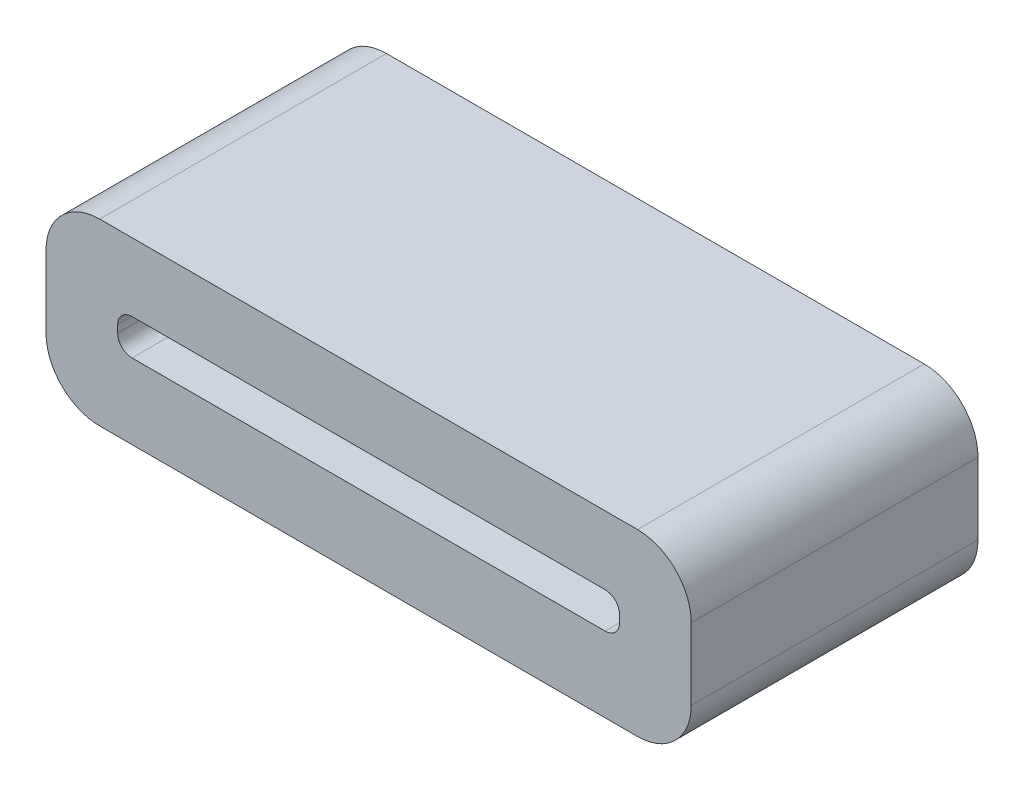
ISO-10303-21;
HEADER;
FILE_DESCRIPTION(('STEP AP214'),'2;1');
FILE_NAME('part.step','',(''),(''),'','','');
FILE_SCHEMA(('AUTOMOTIVE_DESIGN { 1 0 10303 214 1 1 1 1 }'));
ENDSEC;
DATA;
#1=APPLICATION_CONTEXT('core data for automotive mechanical design processes');
#2=APPLICATION_PROTOCOL_DEFINITION('international standard','automotive_design',2000,#1);
#3=PRODUCT_CONTEXT('',#1,'mechanical');
#4=PRODUCT('Part','Part','',(#3));
#5=PRODUCT_RELATED_PRODUCT_CATEGORY('part','',(#4));
#6=PRODUCT_DEFINITION_FORMATION('','',#4);
#7=PRODUCT_DEFINITION_CONTEXT('part definition',#1,'design');
#8=PRODUCT_DEFINITION('design','',#6,#7);
#9=PRODUCT_DEFINITION_SHAPE('','',#8);
#10=(LENGTH_UNIT() NAMED_UNIT(*) SI_UNIT(.MILLI.,.METRE.));
#11=(NAMED_UNIT(*) PLANE_ANGLE_UNIT() SI_UNIT($,.RADIAN.));
#12=(NAMED_UNIT(*) SI_UNIT($,.STERADIAN.) SOLID_ANGLE_UNIT());
#13=UNCERTAINTY_MEASURE_WITH_UNIT(LENGTH_MEASURE(1.E-05),#10,'distance_accuracy_value','');
#14=(GEOMETRIC_REPRESENTATION_CONTEXT(3) GLOBAL_UNCERTAINTY_ASSIGNED_CONTEXT((#13)) GLOBAL_UNIT_ASSIGNED_CONTEXT((#10,
#11,#12)) REPRESENTATION_CONTEXT('',''));
#15=CARTESIAN_POINT('',(0.,0.,0.));
#16=DIRECTION('',(0.,0.,1.));
#17=DIRECTION('',(1.,0.,0.));
#18=AXIS2_PLACEMENT_3D('',#15,#16,#17);
#19=CARTESIAN_POINT('',(16.5,3.50000000000001,8.00000000000001));
#20=DIRECTION('',(0.,0.,-1.));
#21=DIRECTION('',(-1.,0.,0.));
#22=AXIS2_PLACEMENT_3D('',#19,#20,#21);
#23=CYLINDRICAL_SURFACE('',#22,1.5);
#24=CARTESIAN_POINT('',(16.5000000000001,3.50000000000001,0.));
#25=DIRECTION('',(0.,0.,1.));
#26=DIRECTION('',(-1.,0.,0.));
#27=AXIS2_PLACEMENT_3D('',#24,#25,#26);
#28=CIRCLE('',#27,1.5);
#29=CARTESIAN_POINT('',(18.0000000000001,3.50000000000001,0.));
#30=VERTEX_POINT('',#29);
#31=CARTESIAN_POINT('',(16.5000000000001,5.00000000000001,0.));
#32=VERTEX_POINT('',#31);
#33=EDGE_CURVE('E201',#30,#32,#28,.T.);
#34=ORIENTED_EDGE('',*,*,#33,.T.);
#35=DIRECTION('',(0.,0.,-1.));
#36=VECTOR('',#35,1.);
#37=CARTESIAN_POINT('',(16.5,5.00000000000001,8.00000000000001));
#38=LINE('',#37,#36);
#39=CARTESIAN_POINT('',(16.5,5.00000000000001,8.00000000000001));
#40=VERTEX_POINT('',#39);
#41=EDGE_CURVE('E11',#40,#32,#38,.T.);
#42=ORIENTED_EDGE('',*,*,#41,.F.);
#43=CARTESIAN_POINT('',(16.5,3.50000000000001,8.00000000000001));
#44=DIRECTION('',(0.,0.,1.));
#45=DIRECTION('',(-1.,0.,0.));
#46=AXIS2_PLACEMENT_3D('',#43,#44,#45);
#47=CIRCLE('',#46,1.5);
#48=CARTESIAN_POINT('',(18.,3.5,8.00000000000001));
#49=VERTEX_POINT('',#48);
#50=EDGE_CURVE('E213',#49,#40,#47,.T.);
#51=ORIENTED_EDGE('',*,*,#50,.F.);
#52=DIRECTION('',(0.,0.,-1.));
#53=VECTOR('',#52,1.);
#54=CARTESIAN_POINT('',(18.,3.5,8.00000000000001));
#55=LINE('',#54,#53);
#56=EDGE_CURVE('E231',#49,#30,#55,.T.);
#57=ORIENTED_EDGE('',*,*,#56,.T.);
#58=EDGE_LOOP('',(#34,#42,#51,#57));
#59=FACE_BOUND('',#58,.T.);
#60=ADVANCED_FACE('F32',(#59),#23,.T.);
#61=CARTESIAN_POINT('',(1.50000000000002,5.,8.00000000000001));
#62=DIRECTION('',(0.,-1.,0.));
#63=DIRECTION('',(0.,0.,-1.));
#64=AXIS2_PLACEMENT_3D('',#61,#62,#63);
#65=PLANE('',#64);
#66=DIRECTION('',(-1.,0.,0.));
#67=VECTOR('',#66,1.);
#68=CARTESIAN_POINT('',(1.50000000000002,5.,0.));
#69=LINE('',#68,#67);
#70=CARTESIAN_POINT('',(1.50000000000002,5.,0.));
#71=VERTEX_POINT('',#70);
#72=EDGE_CURVE('E234',#32,#71,#69,.T.);
#73=ORIENTED_EDGE('',*,*,#72,.T.);
#74=DIRECTION('',(0.,0.,-1.));
#75=VECTOR('',#74,1.);
#76=CARTESIAN_POINT('',(1.50000000000002,5.,8.00000000000001));
#77=LINE('',#76,#75);
#78=CARTESIAN_POINT('',(1.50000000000002,5.,8.00000000000001));
#79=VERTEX_POINT('',#78);
#80=EDGE_CURVE('E39',#79,#71,#77,.T.);
#81=ORIENTED_EDGE('',*,*,#80,.F.);
#82=DIRECTION('',(-1.,0.,0.));
#83=VECTOR('',#82,1.);
#84=CARTESIAN_POINT('',(1.50000000000002,5.,8.00000000000001));
#85=LINE('',#84,#83);
#86=EDGE_CURVE('E216',#40,#79,#85,.T.);
#87=ORIENTED_EDGE('',*,*,#86,.F.);
#88=ORIENTED_EDGE('',*,*,#41,.T.);
#89=EDGE_LOOP('',(#73,#81,#87,#88));
#90=FACE_BOUND('',#89,.T.);
#91=ADVANCED_FACE('F289',(#90),#65,.F.);
#92=CARTESIAN_POINT('',(1.50000000000001,3.5,8.00000000000001));
#93=DIRECTION('',(0.,0.,-1.));
#94=DIRECTION('',(-1.,0.,0.));
#95=AXIS2_PLACEMENT_3D('',#92,#93,#94);
#96=CYLINDRICAL_SURFACE('',#95,1.5);
#97=CARTESIAN_POINT('',(1.5,3.5,0.));
#98=DIRECTION('',(0.,0.,1.));
#99=DIRECTION('',(-1.,0.,0.));
#100=AXIS2_PLACEMENT_3D('',#97,#98,#99);
#101=CIRCLE('',#100,1.5);
#102=CARTESIAN_POINT('',(0.,3.49999999999999,0.));
#103=VERTEX_POINT('',#102);
#104=EDGE_CURVE('E236',#71,#103,#101,.T.);
#105=ORIENTED_EDGE('',*,*,#104,.T.);
#106=DIRECTION('',(0.,0.,-1.));
#107=VECTOR('',#106,1.);
#108=CARTESIAN_POINT('',(0.,3.49999999999999,8.00000000000001));
#109=LINE('',#108,#107);
#110=CARTESIAN_POINT('',(0.,3.49999999999999,8.00000000000001));
#111=VERTEX_POINT('',#110);
#112=EDGE_CURVE('E261',#111,#103,#109,.T.);
#113=ORIENTED_EDGE('',*,*,#112,.F.);
#114=CARTESIAN_POINT('',(1.50000000000001,3.5,8.00000000000001));
#115=DIRECTION('',(0.,0.,1.));
#116=DIRECTION('',(-1.,0.,0.));
#117=AXIS2_PLACEMENT_3D('',#114,#115,#116);
#118=CIRCLE('',#117,1.5);
#119=EDGE_CURVE('E219',#79,#111,#118,.T.);
#120=ORIENTED_EDGE('',*,*,#119,.F.);
#121=ORIENTED_EDGE('',*,*,#80,.T.);
#122=EDGE_LOOP('',(#105,#113,#120,#121));
#123=FACE_BOUND('',#122,.T.);
#124=ADVANCED_FACE('F268',(#123),#96,.T.);
#125=CARTESIAN_POINT('',(0.,1.50000000000001,7.99999999999995));
#126=DIRECTION('',(1.,0.,0.));
#127=DIRECTION('',(0.,1.,0.));
#128=AXIS2_PLACEMENT_3D('',#125,#126,#127);
#129=PLANE('',#128);
#130=DIRECTION('',(0.,-1.,0.));
#131=VECTOR('',#130,1.);
#132=CARTESIAN_POINT('',(0.,1.50000000000001,0.));
#133=LINE('',#132,#131);
#134=CARTESIAN_POINT('',(0.,1.50000000000001,0.));
#135=VERTEX_POINT('',#134);
#136=EDGE_CURVE('E238',#103,#135,#133,.T.);
#137=ORIENTED_EDGE('',*,*,#136,.T.);
#138=DIRECTION('',(0.,0.,-1.));
#139=VECTOR('',#138,1.);
#140=CARTESIAN_POINT('',(0.,1.50000000000001,7.99999999999995));
#141=LINE('',#140,#139);
#142=CARTESIAN_POINT('',(0.,1.50000000000001,7.99999999999995));
#143=VERTEX_POINT('',#142);
#144=EDGE_CURVE('E258',#143,#135,#141,.T.);
#145=ORIENTED_EDGE('',*,*,#144,.F.);
#146=DIRECTION('',(0.,-1.,0.));
#147=VECTOR('',#146,1.);
#148=CARTESIAN_POINT('',(0.,1.50000000000001,7.99999999999995));
#149=LINE('',#148,#147);
#150=EDGE_CURVE('E221',#111,#143,#149,.T.);
#151=ORIENTED_EDGE('',*,*,#150,.F.);
#152=ORIENTED_EDGE('',*,*,#112,.T.);
#153=EDGE_LOOP('',(#137,#145,#151,#152));
#154=FACE_BOUND('',#153,.T.);
#155=ADVANCED_FACE('F277',(#154),#129,.F.);
#156=CARTESIAN_POINT('',(1.50000000000001,1.5,7.99999999999995));
#157=DIRECTION('',(0.,0.,-1.));
#158=DIRECTION('',(-1.,0.,0.));
#159=AXIS2_PLACEMENT_3D('',#156,#157,#158);
#160=CYLINDRICAL_SURFACE('',#159,1.5);
#161=CARTESIAN_POINT('',(1.5,1.5,0.));
#162=DIRECTION('',(0.,0.,1.));
#163=DIRECTION('',(-1.,0.,0.));
#164=AXIS2_PLACEMENT_3D('',#161,#162,#163);
#165=CIRCLE('',#164,1.5);
#166=CARTESIAN_POINT('',(1.50000000000002,0.,0.));
#167=VERTEX_POINT('',#166);
#168=EDGE_CURVE('E240',#135,#167,#165,.T.);
#169=ORIENTED_EDGE('',*,*,#168,.T.);
#170=DIRECTION('',(0.,0.,-1.));
#171=VECTOR('',#170,1.);
#172=CARTESIAN_POINT('',(1.50000000000002,0.,8.00000000000001));
#173=LINE('',#172,#171);
#174=CARTESIAN_POINT('',(1.50000000000002,0.,8.00000000000001));
#175=VERTEX_POINT('',#174);
#176=EDGE_CURVE('E255',#175,#167,#173,.T.);
#177=ORIENTED_EDGE('',*,*,#176,.F.);
#178=CARTESIAN_POINT('',(1.50000000000001,1.5,7.99999999999995));
#179=DIRECTION('',(0.,0.,1.));
#180=DIRECTION('',(-1.,0.,0.));
#181=AXIS2_PLACEMENT_3D('',#178,#179,#180);
#182=CIRCLE('',#181,1.5);
#183=EDGE_CURVE('E223',#143,#175,#182,.T.);
#184=ORIENTED_EDGE('',*,*,#183,.F.);
#185=ORIENTED_EDGE('',*,*,#144,.T.);
#186=EDGE_LOOP('',(#169,#177,#184,#185));
#187=FACE_BOUND('',#186,.T.);
#188=ADVANCED_FACE('F281',(#187),#160,.T.);
#189=CARTESIAN_POINT('',(1.50000000000002,0.,8.00000000000001));
#190=DIRECTION('',(0.,1.,0.));
#191=DIRECTION('',(0.,0.,1.));
#192=AXIS2_PLACEMENT_3D('',#189,#190,#191);
#193=PLANE('',#192);
#194=DIRECTION('',(1.,0.,0.));
#195=VECTOR('',#194,1.);
#196=CARTESIAN_POINT('',(1.50000000000002,0.,0.));
#197=LINE('',#196,#195);
#198=CARTESIAN_POINT('',(16.5,0.,0.));
#199=VERTEX_POINT('',#198);
#200=EDGE_CURVE('E242',#167,#199,#197,.T.);
#201=ORIENTED_EDGE('',*,*,#200,.T.);
#202=DIRECTION('',(0.,0.,-1.));
#203=VECTOR('',#202,1.);
#204=CARTESIAN_POINT('',(16.5,0.,8.00000000000001));
#205=LINE('',#204,#203);
#206=CARTESIAN_POINT('',(16.5,0.,8.00000000000001));
#207=VERTEX_POINT('',#206);
#208=EDGE_CURVE('E252',#207,#199,#205,.T.);
#209=ORIENTED_EDGE('',*,*,#208,.F.);
#210=DIRECTION('',(1.,0.,0.));
#211=VECTOR('',#210,1.);
#212=CARTESIAN_POINT('',(1.50000000000002,0.,8.00000000000001));
#213=LINE('',#212,#211);
#214=EDGE_CURVE('E225',#175,#207,#213,.T.);
#215=ORIENTED_EDGE('',*,*,#214,.F.);
#216=ORIENTED_EDGE('',*,*,#176,.T.);
#217=EDGE_LOOP('',(#201,#209,#215,#216));
#218=FACE_BOUND('',#217,.T.);
#219=ADVANCED_FACE('F302',(#218),#193,.F.);
#220=CARTESIAN_POINT('',(16.5,1.50000000000001,8.00000000000001));
#221=DIRECTION('',(0.,0.,-1.));
#222=DIRECTION('',(-1.,0.,0.));
#223=AXIS2_PLACEMENT_3D('',#220,#221,#222);
#224=CYLINDRICAL_SURFACE('',#223,1.5);
#225=CARTESIAN_POINT('',(16.5,1.50000000000001,0.));
#226=DIRECTION('',(0.,0.,1.));
#227=DIRECTION('',(1.,0.,0.));
#228=AXIS2_PLACEMENT_3D('',#225,#226,#227);
#229=CIRCLE('',#228,1.5);
#230=CARTESIAN_POINT('',(18.,1.50000000000003,0.));
#231=VERTEX_POINT('',#230);
#232=EDGE_CURVE('E244',#199,#231,#229,.T.);
#233=ORIENTED_EDGE('',*,*,#232,.T.);
#234=DIRECTION('',(0.,0.,-1.));
#235=VECTOR('',#234,1.);
#236=CARTESIAN_POINT('',(18.,1.50000000000002,8.00000000000001));
#237=LINE('',#236,#235);
#238=CARTESIAN_POINT('',(18.,1.50000000000002,8.00000000000001));
#239=VERTEX_POINT('',#238);
#240=EDGE_CURVE('E249',#239,#231,#237,.T.);
#241=ORIENTED_EDGE('',*,*,#240,.F.);
#242=CARTESIAN_POINT('',(16.5,1.50000000000001,8.00000000000001));
#243=DIRECTION('',(0.,0.,1.));
#244=DIRECTION('',(1.,0.,0.));
#245=AXIS2_PLACEMENT_3D('',#242,#243,#244);
#246=CIRCLE('',#245,1.5);
#247=EDGE_CURVE('E227',#207,#239,#246,.T.);
#248=ORIENTED_EDGE('',*,*,#247,.F.);
#249=ORIENTED_EDGE('',*,*,#208,.T.);
#250=EDGE_LOOP('',(#233,#241,#248,#249));
#251=FACE_BOUND('',#250,.T.);
#252=ADVANCED_FACE('F300',(#251),#224,.T.);
#253=CARTESIAN_POINT('',(18.,1.50000000000002,8.00000000000001));
#254=DIRECTION('',(-1.,0.,0.));
#255=DIRECTION('',(0.,0.,1.));
#256=AXIS2_PLACEMENT_3D('',#253,#254,#255);
#257=PLANE('',#256);
#258=DIRECTION('',(0.,1.,0.));
#259=VECTOR('',#258,1.);
#260=CARTESIAN_POINT('',(18.,1.50000000000003,0.));
#261=LINE('',#260,#259);
#262=EDGE_CURVE('E217',#231,#30,#261,.T.);
#263=ORIENTED_EDGE('',*,*,#262,.T.);
#264=ORIENTED_EDGE('',*,*,#56,.F.);
#265=DIRECTION('',(0.,1.,0.));
#266=VECTOR('',#265,1.);
#267=CARTESIAN_POINT('',(18.,1.50000000000002,8.00000000000001));
#268=LINE('',#267,#266);
#269=EDGE_CURVE('E229',#239,#49,#268,.T.);
#270=ORIENTED_EDGE('',*,*,#269,.F.);
#271=ORIENTED_EDGE('',*,*,#240,.T.);
#272=EDGE_LOOP('',(#263,#264,#270,#271));
#273=FACE_BOUND('',#272,.T.);
#274=ADVANCED_FACE('F295',(#273),#257,.F.);
#275=CARTESIAN_POINT('',(16.5,3.50000000000001,8.00000000000001));
#276=DIRECTION('',(0.,0.,-1.));
#277=DIRECTION('',(-1.,0.,0.));
#278=AXIS2_PLACEMENT_3D('',#275,#276,#277);
#279=PLANE('',#278);
#280=DIRECTION('',(0.,-1.,0.));
#281=VECTOR('',#280,1.);
#282=CARTESIAN_POINT('',(2.00000000000001,2.69537572254338,8.00000000000001));
#283=LINE('',#282,#281);
#284=CARTESIAN_POINT('',(2.00000000000001,2.69537572254338,8.00000000000001));
#285=VERTEX_POINT('',#284);
#286=CARTESIAN_POINT('',(2.00000000000001,2.49537572254338,8.00000000000001));
#287=VERTEX_POINT('',#286);
#288=EDGE_CURVE('E183',#285,#287,#283,.T.);
#289=ORIENTED_EDGE('',*,*,#288,.F.);
#290=CARTESIAN_POINT('',(2.40000000000001,2.69537572254338,8.00000000000001));
#291=DIRECTION('',(0.,0.,1.));
#292=DIRECTION('',(1.,0.,0.));
#293=AXIS2_PLACEMENT_3D('',#290,#291,#292);
#294=CIRCLE('',#293,0.4);
#295=CARTESIAN_POINT('',(2.40000000000001,3.09537572254338,8.00000000000001));
#296=VERTEX_POINT('',#295);
#297=EDGE_CURVE('E46',#296,#285,#294,.T.);
#298=ORIENTED_EDGE('',*,*,#297,.F.);
#299=DIRECTION('',(-1.,0.,0.));
#300=VECTOR('',#299,1.);
#301=CARTESIAN_POINT('',(2.40000000000001,3.09537572254338,8.00000000000001));
#302=LINE('',#301,#300);
#303=CARTESIAN_POINT('',(15.6,3.09537572254339,8.00000000000001));
#304=VERTEX_POINT('',#303);
#305=EDGE_CURVE('E163',#304,#296,#302,.T.);
#306=ORIENTED_EDGE('',*,*,#305,.F.);
#307=CARTESIAN_POINT('',(15.6000000000001,2.69537572254339,8.00000000000001));
#308=DIRECTION('',(0.,0.,1.));
#309=DIRECTION('',(-1.,0.,0.));
#310=AXIS2_PLACEMENT_3D('',#307,#308,#309);
#311=CIRCLE('',#310,0.4);
#312=CARTESIAN_POINT('',(16.,2.69537572254339,8.00000000000001));
#313=VERTEX_POINT('',#312);
#314=EDGE_CURVE('E166',#313,#304,#311,.T.);
#315=ORIENTED_EDGE('',*,*,#314,.F.);
#316=DIRECTION('',(0.,1.,0.));
#317=VECTOR('',#316,1.);
#318=CARTESIAN_POINT('',(16.,2.69537572254339,8.00000000000001));
#319=LINE('',#318,#317);
#320=CARTESIAN_POINT('',(16.,2.4953757225434,8.00000000000001));
#321=VERTEX_POINT('',#320);
#322=EDGE_CURVE('E194',#321,#313,#319,.T.);
#323=ORIENTED_EDGE('',*,*,#322,.F.);
#324=CARTESIAN_POINT('',(15.6000000000001,2.49537572254339,8.00000000000001));
#325=DIRECTION('',(0.,0.,1.));
#326=DIRECTION('',(1.,0.,0.));
#327=AXIS2_PLACEMENT_3D('',#324,#325,#326);
#328=CIRCLE('',#327,0.4);
#329=CARTESIAN_POINT('',(15.6,2.09537572254339,7.99999999999995));
#330=VERTEX_POINT('',#329);
#331=EDGE_CURVE('E191',#330,#321,#328,.T.);
#332=ORIENTED_EDGE('',*,*,#331,.F.);
#333=DIRECTION('',(1.,0.,0.));
#334=VECTOR('',#333,1.);
#335=CARTESIAN_POINT('',(2.40000000000001,2.09537572254338,8.00000000000001));
#336=LINE('',#335,#334);
#337=CARTESIAN_POINT('',(2.40000000000001,2.09537572254338,8.00000000000001));
#338=VERTEX_POINT('',#337);
#339=EDGE_CURVE('E188',#338,#330,#336,.T.);
#340=ORIENTED_EDGE('',*,*,#339,.F.);
#341=CARTESIAN_POINT('',(2.40000000000001,2.49537572254338,8.00000000000001));
#342=DIRECTION('',(0.,0.,1.));
#343=DIRECTION('',(1.,0.,0.));
#344=AXIS2_PLACEMENT_3D('',#341,#342,#343);
#345=CIRCLE('',#344,0.4);
#346=EDGE_CURVE('E185',#287,#338,#345,.T.);
#347=ORIENTED_EDGE('',*,*,#346,.F.);
#348=EDGE_LOOP('',(#289,#298,#306,#315,#323,#332,#340,#347));
#349=FACE_BOUND('',#348,.T.);
#350=ORIENTED_EDGE('',*,*,#50,.T.);
#351=ORIENTED_EDGE('',*,*,#86,.T.);
#352=ORIENTED_EDGE('',*,*,#119,.T.);
#353=ORIENTED_EDGE('',*,*,#150,.T.);
#354=ORIENTED_EDGE('',*,*,#183,.T.);
#355=ORIENTED_EDGE('',*,*,#214,.T.);
#356=ORIENTED_EDGE('',*,*,#247,.T.);
#357=ORIENTED_EDGE('',*,*,#269,.T.);
#358=EDGE_LOOP('',(#350,#351,#352,#353,#354,#355,#356,#357));
#359=FACE_BOUND('',#358,.T.);
#360=ADVANCED_FACE('F285',(#349,#359),#279,.F.);
#361=CARTESIAN_POINT('',(16.5000000000001,3.50000000000001,0.));
#362=DIRECTION('',(0.,0.,-1.));
#363=DIRECTION('',(-1.,0.,0.));
#364=AXIS2_PLACEMENT_3D('',#361,#362,#363);
#365=PLANE('',#364);
#366=CARTESIAN_POINT('',(2.40000000000001,2.69537572254338,0.));
#367=DIRECTION('',(0.,0.,1.));
#368=DIRECTION('',(1.,0.,0.));
#369=AXIS2_PLACEMENT_3D('',#366,#367,#368);
#370=CIRCLE('',#369,0.4);
#371=CARTESIAN_POINT('',(2.40000000000001,3.09537572254338,0.));
#372=VERTEX_POINT('',#371);
#373=CARTESIAN_POINT('',(2.00000000000001,2.69537572254338,0.));
#374=VERTEX_POINT('',#373);
#375=EDGE_CURVE('E146',#372,#374,#370,.T.);
#376=ORIENTED_EDGE('',*,*,#375,.T.);
#377=DIRECTION('',(0.,-1.,0.));
#378=VECTOR('',#377,1.);
#379=CARTESIAN_POINT('',(2.00000000000001,2.69537572254338,0.));
#380=LINE('',#379,#378);
#381=CARTESIAN_POINT('',(2.00000000000001,2.49537572254338,0.));
#382=VERTEX_POINT('',#381);
#383=EDGE_CURVE('E155',#374,#382,#380,.T.);
#384=ORIENTED_EDGE('',*,*,#383,.T.);
#385=CARTESIAN_POINT('',(2.40000000000001,2.49537572254338,0.));
#386=DIRECTION('',(0.,0.,1.));
#387=DIRECTION('',(1.,0.,0.));
#388=AXIS2_PLACEMENT_3D('',#385,#386,#387);
#389=CIRCLE('',#388,0.4);
#390=CARTESIAN_POINT('',(2.40000000000001,2.09537572254338,0.));
#391=VERTEX_POINT('',#390);
#392=EDGE_CURVE('E54',#382,#391,#389,.T.);
#393=ORIENTED_EDGE('',*,*,#392,.T.);
#394=DIRECTION('',(1.,0.,0.));
#395=VECTOR('',#394,1.);
#396=CARTESIAN_POINT('',(2.40000000000001,2.09537572254338,0.));
#397=LINE('',#396,#395);
#398=CARTESIAN_POINT('',(15.6,2.09537572254339,0.));
#399=VERTEX_POINT('',#398);
#400=EDGE_CURVE('E170',#391,#399,#397,.T.);
#401=ORIENTED_EDGE('',*,*,#400,.T.);
#402=CARTESIAN_POINT('',(15.6000000000001,2.49537572254339,0.));
#403=DIRECTION('',(0.,0.,1.));
#404=DIRECTION('',(1.,0.,0.));
#405=AXIS2_PLACEMENT_3D('',#402,#403,#404);
#406=CIRCLE('',#405,0.4);
#407=CARTESIAN_POINT('',(16.0000000000001,2.4953757225434,0.));
#408=VERTEX_POINT('',#407);
#409=EDGE_CURVE('E173',#399,#408,#406,.T.);
#410=ORIENTED_EDGE('',*,*,#409,.T.);
#411=DIRECTION('',(0.,1.,0.));
#412=VECTOR('',#411,1.);
#413=CARTESIAN_POINT('',(16.0000000000001,2.69537572254339,0.));
#414=LINE('',#413,#412);
#415=CARTESIAN_POINT('',(16.0000000000001,2.69537572254339,0.));
#416=VERTEX_POINT('',#415);
#417=EDGE_CURVE('E176',#408,#416,#414,.T.);
#418=ORIENTED_EDGE('',*,*,#417,.T.);
#419=CARTESIAN_POINT('',(15.6000000000001,2.69537572254339,0.));
#420=DIRECTION('',(0.,0.,1.));
#421=DIRECTION('',(-1.,0.,0.));
#422=AXIS2_PLACEMENT_3D('',#419,#420,#421);
#423=CIRCLE('',#422,0.4);
#424=CARTESIAN_POINT('',(15.6,3.09537572254339,0.));
#425=VERTEX_POINT('',#424);
#426=EDGE_CURVE('E179',#416,#425,#423,.T.);
#427=ORIENTED_EDGE('',*,*,#426,.T.);
#428=DIRECTION('',(-1.,0.,0.));
#429=VECTOR('',#428,1.);
#430=CARTESIAN_POINT('',(2.40000000000001,3.09537572254338,0.));
#431=LINE('',#430,#429);
#432=EDGE_CURVE('E152',#425,#372,#431,.T.);
#433=ORIENTED_EDGE('',*,*,#432,.T.);
#434=EDGE_LOOP('',(#376,#384,#393,#401,#410,#418,#427,#433));
#435=FACE_BOUND('',#434,.T.);
#436=ORIENTED_EDGE('',*,*,#33,.F.);
#437=ORIENTED_EDGE('',*,*,#262,.F.);
#438=ORIENTED_EDGE('',*,*,#232,.F.);
#439=ORIENTED_EDGE('',*,*,#200,.F.);
#440=ORIENTED_EDGE('',*,*,#168,.F.);
#441=ORIENTED_EDGE('',*,*,#136,.F.);
#442=ORIENTED_EDGE('',*,*,#104,.F.);
#443=ORIENTED_EDGE('',*,*,#72,.F.);
#444=EDGE_LOOP('',(#436,#437,#438,#439,#440,#441,#442,#443));
#445=FACE_BOUND('',#444,.T.);
#446=ADVANCED_FACE('F159',(#435,#445),#365,.T.);
#447=CARTESIAN_POINT('',(2.40000000000001,2.69537572254338,0.));
#448=DIRECTION('',(0.,0.,1.));
#449=DIRECTION('',(1.,0.,0.));
#450=AXIS2_PLACEMENT_3D('',#447,#448,#449);
#451=CYLINDRICAL_SURFACE('',#450,0.4);
#452=ORIENTED_EDGE('',*,*,#297,.T.);
#453=DIRECTION('',(0.,0.,1.));
#454=VECTOR('',#453,1.);
#455=CARTESIAN_POINT('',(2.00000000000001,2.69537572254338,0.));
#456=LINE('',#455,#454);
#457=EDGE_CURVE('E142',#374,#285,#456,.T.);
#458=ORIENTED_EDGE('',*,*,#457,.F.);
#459=ORIENTED_EDGE('',*,*,#375,.F.);
#460=DIRECTION('',(0.,0.,1.));
#461=VECTOR('',#460,1.);
#462=CARTESIAN_POINT('',(2.40000000000001,3.09537572254338,0.));
#463=LINE('',#462,#461);
#464=EDGE_CURVE('E199',#372,#296,#463,.T.);
#465=ORIENTED_EDGE('',*,*,#464,.T.);
#466=EDGE_LOOP('',(#452,#458,#459,#465));
#467=FACE_BOUND('',#466,.T.);
#468=ADVANCED_FACE('F144',(#467),#451,.F.);
#469=CARTESIAN_POINT('',(2.40000000000001,3.09537572254338,0.));
#470=DIRECTION('',(0.,1.,0.));
#471=DIRECTION('',(-1.,0.,0.));
#472=AXIS2_PLACEMENT_3D('',#469,#470,#471);
#473=PLANE('',#472);
#474=ORIENTED_EDGE('',*,*,#305,.T.);
#475=ORIENTED_EDGE('',*,*,#464,.F.);
#476=ORIENTED_EDGE('',*,*,#432,.F.);
#477=DIRECTION('',(0.,0.,1.));
#478=VECTOR('',#477,1.);
#479=CARTESIAN_POINT('',(15.6,3.09537572254339,0.));
#480=LINE('',#479,#478);
#481=EDGE_CURVE('E202',#425,#304,#480,.T.);
#482=ORIENTED_EDGE('',*,*,#481,.T.);
#483=EDGE_LOOP('',(#474,#475,#476,#482));
#484=FACE_BOUND('',#483,.T.);
#485=ADVANCED_FACE('F361',(#484),#473,.F.);
#486=CARTESIAN_POINT('',(15.6000000000001,2.69537572254339,0.));
#487=DIRECTION('',(0.,0.,1.));
#488=DIRECTION('',(1.,0.,0.));
#489=AXIS2_PLACEMENT_3D('',#486,#487,#488);
#490=CYLINDRICAL_SURFACE('',#489,0.4);
#491=ORIENTED_EDGE('',*,*,#314,.T.);
#492=ORIENTED_EDGE('',*,*,#481,.F.);
#493=ORIENTED_EDGE('',*,*,#426,.F.);
#494=DIRECTION('',(0.,0.,1.));
#495=VECTOR('',#494,1.);
#496=CARTESIAN_POINT('',(16.0000000000001,2.69537572254339,0.));
#497=LINE('',#496,#495);
#498=EDGE_CURVE('E204',#416,#313,#497,.T.);
#499=ORIENTED_EDGE('',*,*,#498,.T.);
#500=EDGE_LOOP('',(#491,#492,#493,#499));
#501=FACE_BOUND('',#500,.T.);
#502=ADVANCED_FACE('F368',(#501),#490,.F.);
#503=CARTESIAN_POINT('',(16.0000000000001,2.69537572254339,0.));
#504=DIRECTION('',(1.,0.,0.));
#505=DIRECTION('',(0.,0.,-1.));
#506=AXIS2_PLACEMENT_3D('',#503,#504,#505);
#507=PLANE('',#506);
#508=ORIENTED_EDGE('',*,*,#322,.T.);
#509=ORIENTED_EDGE('',*,*,#498,.F.);
#510=ORIENTED_EDGE('',*,*,#417,.F.);
#511=DIRECTION('',(0.,0.,1.));
#512=VECTOR('',#511,1.);
#513=CARTESIAN_POINT('',(16.0000000000001,2.4953757225434,0.));
#514=LINE('',#513,#512);
#515=EDGE_CURVE('E206',#408,#321,#514,.T.);
#516=ORIENTED_EDGE('',*,*,#515,.T.);
#517=EDGE_LOOP('',(#508,#509,#510,#516));
#518=FACE_BOUND('',#517,.T.);
#519=ADVANCED_FACE('F376',(#518),#507,.F.);
#520=CARTESIAN_POINT('',(15.6000000000001,2.49537572254339,0.));
#521=DIRECTION('',(0.,0.,1.));
#522=DIRECTION('',(1.,0.,0.));
#523=AXIS2_PLACEMENT_3D('',#520,#521,#522);
#524=CYLINDRICAL_SURFACE('',#523,0.4);
#525=ORIENTED_EDGE('',*,*,#331,.T.);
#526=ORIENTED_EDGE('',*,*,#515,.F.);
#527=ORIENTED_EDGE('',*,*,#409,.F.);
#528=DIRECTION('',(0.,0.,1.));
#529=VECTOR('',#528,1.);
#530=CARTESIAN_POINT('',(15.6,2.09537572254339,0.));
#531=LINE('',#530,#529);
#532=EDGE_CURVE('E208',#399,#330,#531,.T.);
#533=ORIENTED_EDGE('',*,*,#532,.T.);
#534=EDGE_LOOP('',(#525,#526,#527,#533));
#535=FACE_BOUND('',#534,.T.);
#536=ADVANCED_FACE('F384',(#535),#524,.F.);
#537=CARTESIAN_POINT('',(2.40000000000001,2.09537572254338,0.));
#538=DIRECTION('',(0.,-1.,0.));
#539=DIRECTION('',(0.,0.,-1.));
#540=AXIS2_PLACEMENT_3D('',#537,#538,#539);
#541=PLANE('',#540);
#542=ORIENTED_EDGE('',*,*,#339,.T.);
#543=ORIENTED_EDGE('',*,*,#532,.F.);
#544=ORIENTED_EDGE('',*,*,#400,.F.);
#545=DIRECTION('',(0.,0.,1.));
#546=VECTOR('',#545,1.);
#547=CARTESIAN_POINT('',(2.40000000000001,2.09537572254338,0.));
#548=LINE('',#547,#546);
#549=EDGE_CURVE('E210',#391,#338,#548,.T.);
#550=ORIENTED_EDGE('',*,*,#549,.T.);
#551=EDGE_LOOP('',(#542,#543,#544,#550));
#552=FACE_BOUND('',#551,.T.);
#553=ADVANCED_FACE('F392',(#552),#541,.F.);
#554=CARTESIAN_POINT('',(2.40000000000001,2.49537572254338,0.));
#555=DIRECTION('',(0.,0.,1.));
#556=DIRECTION('',(1.,0.,0.));
#557=AXIS2_PLACEMENT_3D('',#554,#555,#556);
#558=CYLINDRICAL_SURFACE('',#557,0.4);
#559=ORIENTED_EDGE('',*,*,#346,.T.);
#560=ORIENTED_EDGE('',*,*,#549,.F.);
#561=ORIENTED_EDGE('',*,*,#392,.F.);
#562=DIRECTION('',(0.,0.,1.));
#563=VECTOR('',#562,1.);
#564=CARTESIAN_POINT('',(2.00000000000001,2.49537572254338,0.));
#565=LINE('',#564,#563);
#566=EDGE_CURVE('E151',#382,#287,#565,.T.);
#567=ORIENTED_EDGE('',*,*,#566,.T.);
#568=EDGE_LOOP('',(#559,#560,#561,#567));
#569=FACE_BOUND('',#568,.T.);
#570=ADVANCED_FACE('F400',(#569),#558,.F.);
#571=CARTESIAN_POINT('',(2.00000000000001,2.69537572254338,0.));
#572=DIRECTION('',(-1.,0.,0.));
#573=DIRECTION('',(0.,0.,1.));
#574=AXIS2_PLACEMENT_3D('',#571,#572,#573);
#575=PLANE('',#574);
#576=ORIENTED_EDGE('',*,*,#288,.T.);
#577=ORIENTED_EDGE('',*,*,#566,.F.);
#578=ORIENTED_EDGE('',*,*,#383,.F.);
#579=ORIENTED_EDGE('',*,*,#457,.T.);
#580=EDGE_LOOP('',(#576,#577,#578,#579));
#581=FACE_BOUND('',#580,.T.);
#582=ADVANCED_FACE('F156',(#581),#575,.F.);
#583=CLOSED_SHELL('',(#60,#91,#124,#155,#188,#219,#252,#274,#360,#446,#468,#485,#502,#519,#536,
#553,#570,#582));
#584=MANIFOLD_SOLID_BREP('B2',#583);
#585=ADVANCED_BREP_SHAPE_REPRESENTATION('',(#18,#584),#14);
#586=SHAPE_DEFINITION_REPRESENTATION(#9,#585);
ENDSEC;
END-ISO-10303-21;
